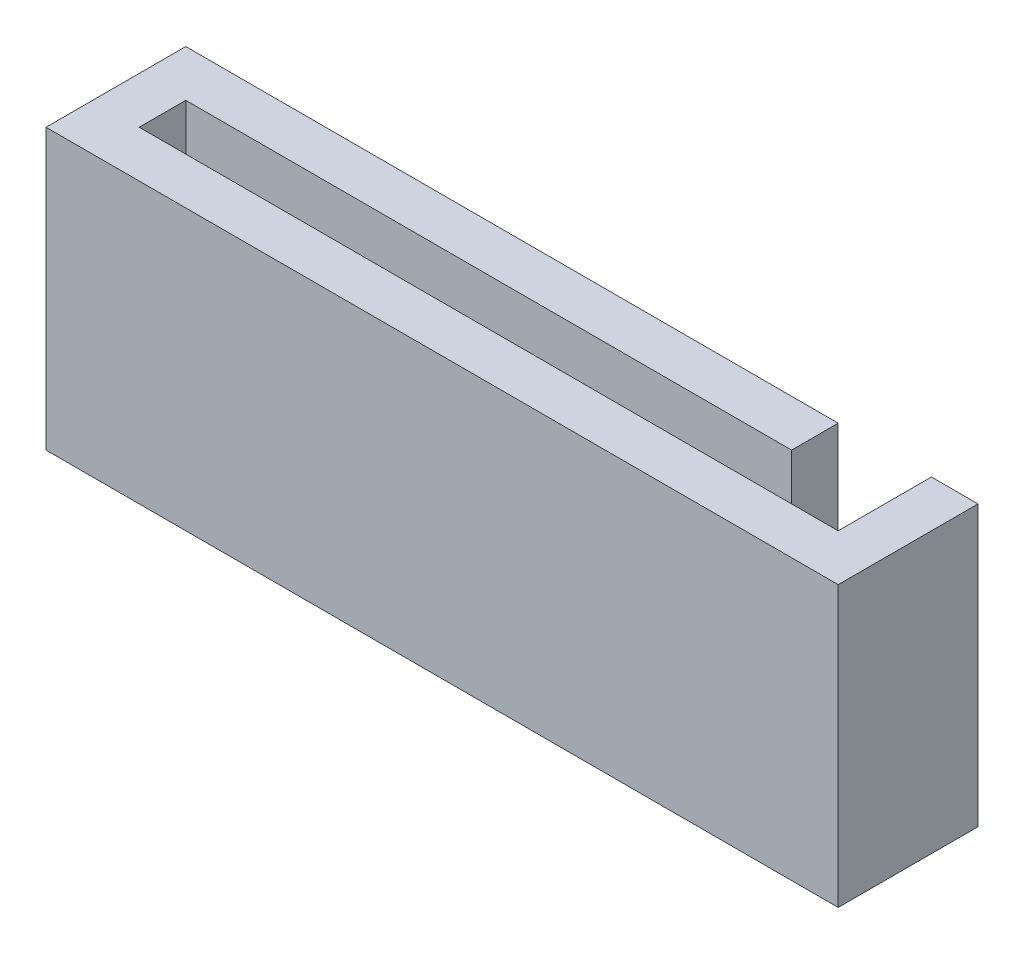
ISO-10303-21;
HEADER;
FILE_DESCRIPTION(('STEP AP214'),'2;1');
FILE_NAME('part.step','',(''),(''),'','','');
FILE_SCHEMA(('AUTOMOTIVE_DESIGN { 1 0 10303 214 1 1 1 1 }'));
ENDSEC;
DATA;
#1=APPLICATION_CONTEXT('core data for automotive mechanical design processes');
#2=APPLICATION_PROTOCOL_DEFINITION('international standard','automotive_design',2000,#1);
#3=PRODUCT_CONTEXT('',#1,'mechanical');
#4=PRODUCT('Part','Part','',(#3));
#5=PRODUCT_RELATED_PRODUCT_CATEGORY('part','',(#4));
#6=PRODUCT_DEFINITION_FORMATION('','',#4);
#7=PRODUCT_DEFINITION_CONTEXT('part definition',#1,'design');
#8=PRODUCT_DEFINITION('design','',#6,#7);
#9=PRODUCT_DEFINITION_SHAPE('','',#8);
#10=(LENGTH_UNIT() NAMED_UNIT(*) SI_UNIT(.MILLI.,.METRE.));
#11=(NAMED_UNIT(*) PLANE_ANGLE_UNIT() SI_UNIT($,.RADIAN.));
#12=(NAMED_UNIT(*) SI_UNIT($,.STERADIAN.) SOLID_ANGLE_UNIT());
#13=UNCERTAINTY_MEASURE_WITH_UNIT(LENGTH_MEASURE(1.E-05),#10,'distance_accuracy_value','');
#14=(GEOMETRIC_REPRESENTATION_CONTEXT(3) GLOBAL_UNCERTAINTY_ASSIGNED_CONTEXT((#13)) GLOBAL_UNIT_ASSIGNED_CONTEXT((#10,
#11,#12)) REPRESENTATION_CONTEXT('',''));
#15=CARTESIAN_POINT('',(0.,0.,0.));
#16=DIRECTION('',(0.,0.,1.));
#17=DIRECTION('',(1.,0.,0.));
#18=AXIS2_PLACEMENT_3D('',#15,#16,#17);
#19=CARTESIAN_POINT('',(0.,6.,-2.));
#20=DIRECTION('',(0.,0.,-1.));
#21=DIRECTION('',(-1.,0.,0.));
#22=AXIS2_PLACEMENT_3D('',#19,#20,#21);
#23=PLANE('',#22);
#24=DIRECTION('',(0.,-1.,0.));
#25=VECTOR('',#24,1.);
#26=CARTESIAN_POINT('',(-16.,6.,-2.));
#27=LINE('',#26,#25);
#28=CARTESIAN_POINT('',(-16.,6.,-2.));
#29=VERTEX_POINT('',#28);
#30=CARTESIAN_POINT('',(-16.,1.,-2.));
#31=VERTEX_POINT('',#30);
#32=EDGE_CURVE('E134',#29,#31,#27,.T.);
#33=ORIENTED_EDGE('',*,*,#32,.T.);
#34=DIRECTION('',(1.,0.,0.));
#35=VECTOR('',#34,1.);
#36=CARTESIAN_POINT('',(0.,1.,-2.));
#37=LINE('',#36,#35);
#38=CARTESIAN_POINT('',(-3.,1.,-2.));
#39=VERTEX_POINT('',#38);
#40=EDGE_CURVE('E54',#31,#39,#37,.T.);
#41=ORIENTED_EDGE('',*,*,#40,.T.);
#42=DIRECTION('',(0.,-1.,0.));
#43=VECTOR('',#42,1.);
#44=CARTESIAN_POINT('',(-3.,6.,-2.));
#45=LINE('',#44,#43);
#46=CARTESIAN_POINT('',(-3.,6.,-2.));
#47=VERTEX_POINT('',#46);
#48=EDGE_CURVE('E11',#47,#39,#45,.T.);
#49=ORIENTED_EDGE('',*,*,#48,.F.);
#50=DIRECTION('',(1.,0.,0.));
#51=VECTOR('',#50,1.);
#52=CARTESIAN_POINT('',(0.,6.,-2.));
#53=LINE('',#52,#51);
#54=EDGE_CURVE('E123',#29,#47,#53,.T.);
#55=ORIENTED_EDGE('',*,*,#54,.F.);
#56=EDGE_LOOP('',(#33,#41,#49,#55));
#57=FACE_BOUND('',#56,.T.);
#58=ADVANCED_FACE('F39',(#57),#23,.F.);
#59=CARTESIAN_POINT('',(-3.,6.,0.));
#60=DIRECTION('',(-1.,0.,0.));
#61=DIRECTION('',(0.,0.,1.));
#62=AXIS2_PLACEMENT_3D('',#59,#60,#61);
#63=PLANE('',#62);
#64=ORIENTED_EDGE('',*,*,#48,.T.);
#65=DIRECTION('',(0.,0.,-1.));
#66=VECTOR('',#65,1.);
#67=CARTESIAN_POINT('',(-3.,1.,0.));
#68=LINE('',#67,#66);
#69=CARTESIAN_POINT('',(-3.,1.,-3.));
#70=VERTEX_POINT('',#69);
#71=EDGE_CURVE('E60',#39,#70,#68,.T.);
#72=ORIENTED_EDGE('',*,*,#71,.T.);
#73=DIRECTION('',(0.,-1.,0.));
#74=VECTOR('',#73,1.);
#75=CARTESIAN_POINT('',(-3.,6.,-3.));
#76=LINE('',#75,#74);
#77=CARTESIAN_POINT('',(-3.,6.,-3.));
#78=VERTEX_POINT('',#77);
#79=EDGE_CURVE('E47',#78,#70,#76,.T.);
#80=ORIENTED_EDGE('',*,*,#79,.F.);
#81=DIRECTION('',(0.,0.,-1.));
#82=VECTOR('',#81,1.);
#83=CARTESIAN_POINT('',(-3.,6.,0.));
#84=LINE('',#83,#82);
#85=EDGE_CURVE('E115',#47,#78,#84,.T.);
#86=ORIENTED_EDGE('',*,*,#85,.F.);
#87=EDGE_LOOP('',(#64,#72,#80,#86));
#88=FACE_BOUND('',#87,.T.);
#89=ADVANCED_FACE('F117',(#88),#63,.F.);
#90=CARTESIAN_POINT('',(-17.,6.,0.));
#91=DIRECTION('',(-1.,0.,0.));
#92=DIRECTION('',(0.,0.,1.));
#93=AXIS2_PLACEMENT_3D('',#90,#91,#92);
#94=PLANE('',#93);
#95=DIRECTION('',(0.,0.,-1.));
#96=VECTOR('',#95,1.);
#97=CARTESIAN_POINT('',(-17.,0.,0.));
#98=LINE('',#97,#96);
#99=CARTESIAN_POINT('',(-17.,0.,0.));
#100=VERTEX_POINT('',#99);
#101=CARTESIAN_POINT('',(-17.,0.,-3.));
#102=VERTEX_POINT('',#101);
#103=EDGE_CURVE('E202',#100,#102,#98,.T.);
#104=ORIENTED_EDGE('',*,*,#103,.F.);
#105=DIRECTION('',(0.,-1.,0.));
#106=VECTOR('',#105,1.);
#107=CARTESIAN_POINT('',(-17.,6.,0.));
#108=LINE('',#107,#106);
#109=CARTESIAN_POINT('',(-17.,6.,0.));
#110=VERTEX_POINT('',#109);
#111=EDGE_CURVE('E264',#110,#100,#108,.T.);
#112=ORIENTED_EDGE('',*,*,#111,.F.);
#113=DIRECTION('',(0.,0.,-1.));
#114=VECTOR('',#113,1.);
#115=CARTESIAN_POINT('',(-17.,6.,0.));
#116=LINE('',#115,#114);
#117=CARTESIAN_POINT('',(-17.,6.,-3.));
#118=VERTEX_POINT('',#117);
#119=EDGE_CURVE('E206',#110,#118,#116,.T.);
#120=ORIENTED_EDGE('',*,*,#119,.T.);
#121=DIRECTION('',(0.,-1.,0.));
#122=VECTOR('',#121,1.);
#123=CARTESIAN_POINT('',(-17.,6.,-3.));
#124=LINE('',#123,#122);
#125=EDGE_CURVE('E267',#118,#102,#124,.T.);
#126=ORIENTED_EDGE('',*,*,#125,.T.);
#127=EDGE_LOOP('',(#104,#112,#120,#126));
#128=FACE_BOUND('',#127,.T.);
#129=ADVANCED_FACE('F139',(#128),#94,.T.);
#130=CARTESIAN_POINT('',(0.,6.,0.));
#131=DIRECTION('',(0.,0.,1.));
#132=DIRECTION('',(1.,0.,0.));
#133=AXIS2_PLACEMENT_3D('',#130,#131,#132);
#134=PLANE('',#133);
#135=DIRECTION('',(-1.,0.,0.));
#136=VECTOR('',#135,1.);
#137=CARTESIAN_POINT('',(0.,0.,0.));
#138=LINE('',#137,#136);
#139=CARTESIAN_POINT('',(0.,0.,0.));
#140=VERTEX_POINT('',#139);
#141=EDGE_CURVE('E234',#140,#100,#138,.T.);
#142=ORIENTED_EDGE('',*,*,#141,.F.);
#143=DIRECTION('',(0.,-1.,0.));
#144=VECTOR('',#143,1.);
#145=CARTESIAN_POINT('',(0.,6.,0.));
#146=LINE('',#145,#144);
#147=CARTESIAN_POINT('',(0.,6.,0.));
#148=VERTEX_POINT('',#147);
#149=EDGE_CURVE('E261',#148,#140,#146,.T.);
#150=ORIENTED_EDGE('',*,*,#149,.F.);
#151=DIRECTION('',(-1.,0.,0.));
#152=VECTOR('',#151,1.);
#153=CARTESIAN_POINT('',(0.,6.,0.));
#154=LINE('',#153,#152);
#155=EDGE_CURVE('E210',#148,#110,#154,.T.);
#156=ORIENTED_EDGE('',*,*,#155,.T.);
#157=ORIENTED_EDGE('',*,*,#111,.T.);
#158=EDGE_LOOP('',(#142,#150,#156,#157));
#159=FACE_BOUND('',#158,.T.);
#160=ADVANCED_FACE('F143',(#159),#134,.T.);
#161=CARTESIAN_POINT('',(0.,6.,0.));
#162=DIRECTION('',(1.,0.,0.));
#163=DIRECTION('',(0.,0.,-1.));
#164=AXIS2_PLACEMENT_3D('',#161,#162,#163);
#165=PLANE('',#164);
#166=DIRECTION('',(0.,0.,1.));
#167=VECTOR('',#166,1.);
#168=CARTESIAN_POINT('',(0.,0.,0.));
#169=LINE('',#168,#167);
#170=CARTESIAN_POINT('',(0.,0.,-3.));
#171=VERTEX_POINT('',#170);
#172=EDGE_CURVE('E238',#171,#140,#169,.T.);
#173=ORIENTED_EDGE('',*,*,#172,.F.);
#174=DIRECTION('',(0.,-1.,0.));
#175=VECTOR('',#174,1.);
#176=CARTESIAN_POINT('',(0.,6.,-3.));
#177=LINE('',#176,#175);
#178=CARTESIAN_POINT('',(0.,6.,-3.));
#179=VERTEX_POINT('',#178);
#180=EDGE_CURVE('E258',#179,#171,#177,.T.);
#181=ORIENTED_EDGE('',*,*,#180,.F.);
#182=DIRECTION('',(0.,0.,1.));
#183=VECTOR('',#182,1.);
#184=CARTESIAN_POINT('',(0.,6.,0.));
#185=LINE('',#184,#183);
#186=EDGE_CURVE('E214',#179,#148,#185,.T.);
#187=ORIENTED_EDGE('',*,*,#186,.T.);
#188=ORIENTED_EDGE('',*,*,#149,.T.);
#189=EDGE_LOOP('',(#173,#181,#187,#188));
#190=FACE_BOUND('',#189,.T.);
#191=ADVANCED_FACE('F149',(#190),#165,.T.);
#192=CARTESIAN_POINT('',(0.,6.,-3.));
#193=DIRECTION('',(0.,0.,-1.));
#194=DIRECTION('',(-1.,0.,0.));
#195=AXIS2_PLACEMENT_3D('',#192,#193,#194);
#196=PLANE('',#195);
#197=DIRECTION('',(1.,0.,0.));
#198=VECTOR('',#197,1.);
#199=CARTESIAN_POINT('',(0.,0.,-3.));
#200=LINE('',#199,#198);
#201=EDGE_CURVE('E132',#102,#171,#200,.T.);
#202=ORIENTED_EDGE('',*,*,#201,.F.);
#203=ORIENTED_EDGE('',*,*,#125,.F.);
#204=DIRECTION('',(1.,0.,0.));
#205=VECTOR('',#204,1.);
#206=CARTESIAN_POINT('',(0.,6.,-3.));
#207=LINE('',#206,#205);
#208=EDGE_CURVE('E122',#118,#78,#207,.T.);
#209=ORIENTED_EDGE('',*,*,#208,.T.);
#210=ORIENTED_EDGE('',*,*,#79,.T.);
#211=DIRECTION('',(1.,0.,0.));
#212=VECTOR('',#211,1.);
#213=CARTESIAN_POINT('',(0.,1.,-3.));
#214=LINE('',#213,#212);
#215=CARTESIAN_POINT('',(-1.,1.,-3.));
#216=VERTEX_POINT('',#215);
#217=EDGE_CURVE('E185',#70,#216,#214,.T.);
#218=ORIENTED_EDGE('',*,*,#217,.T.);
#219=DIRECTION('',(0.,-1.,0.));
#220=VECTOR('',#219,1.);
#221=CARTESIAN_POINT('',(-1.,6.,-3.));
#222=LINE('',#221,#220);
#223=CARTESIAN_POINT('',(-1.,6.,-3.));
#224=VERTEX_POINT('',#223);
#225=EDGE_CURVE('E255',#224,#216,#222,.T.);
#226=ORIENTED_EDGE('',*,*,#225,.F.);
#227=DIRECTION('',(1.,0.,0.));
#228=VECTOR('',#227,1.);
#229=CARTESIAN_POINT('',(0.,6.,-3.));
#230=LINE('',#229,#228);
#231=EDGE_CURVE('E218',#224,#179,#230,.T.);
#232=ORIENTED_EDGE('',*,*,#231,.T.);
#233=ORIENTED_EDGE('',*,*,#180,.T.);
#234=EDGE_LOOP('',(#202,#203,#209,#210,#218,#226,#232,#233));
#235=FACE_BOUND('',#234,.T.);
#236=ADVANCED_FACE('F153',(#235),#196,.T.);
#237=CARTESIAN_POINT('',(-1.,6.,0.));
#238=DIRECTION('',(1.,0.,0.));
#239=DIRECTION('',(0.,0.,-1.));
#240=AXIS2_PLACEMENT_3D('',#237,#238,#239);
#241=PLANE('',#240);
#242=ORIENTED_EDGE('',*,*,#225,.T.);
#243=DIRECTION('',(0.,0.,1.));
#244=VECTOR('',#243,1.);
#245=CARTESIAN_POINT('',(-1.,1.,0.));
#246=LINE('',#245,#244);
#247=CARTESIAN_POINT('',(-1.,1.,-0.999999999999998));
#248=VERTEX_POINT('',#247);
#249=EDGE_CURVE('E198',#216,#248,#246,.T.);
#250=ORIENTED_EDGE('',*,*,#249,.T.);
#251=DIRECTION('',(0.,-1.,0.));
#252=VECTOR('',#251,1.);
#253=CARTESIAN_POINT('',(-1.,6.,-0.999999999999998));
#254=LINE('',#253,#252);
#255=CARTESIAN_POINT('',(-1.,6.,-0.999999999999998));
#256=VERTEX_POINT('',#255);
#257=EDGE_CURVE('E251',#256,#248,#254,.T.);
#258=ORIENTED_EDGE('',*,*,#257,.F.);
#259=DIRECTION('',(0.,0.,1.));
#260=VECTOR('',#259,1.);
#261=CARTESIAN_POINT('',(-1.,6.,0.));
#262=LINE('',#261,#260);
#263=EDGE_CURVE('E222',#224,#256,#262,.T.);
#264=ORIENTED_EDGE('',*,*,#263,.F.);
#265=EDGE_LOOP('',(#242,#250,#258,#264));
#266=FACE_BOUND('',#265,.T.);
#267=ADVANCED_FACE('F157',(#266),#241,.F.);
#268=CARTESIAN_POINT('',(0.,6.,-0.999999999999998));
#269=DIRECTION('',(0.,0.,-1.));
#270=DIRECTION('',(-1.,0.,0.));
#271=AXIS2_PLACEMENT_3D('',#268,#269,#270);
#272=PLANE('',#271);
#273=DIRECTION('',(1.,0.,0.));
#274=VECTOR('',#273,1.);
#275=CARTESIAN_POINT('',(0.,1.,-0.999999999999998));
#276=LINE('',#275,#274);
#277=CARTESIAN_POINT('',(-16.,1.,-0.999999999999998));
#278=VERTEX_POINT('',#277);
#279=EDGE_CURVE('E194',#278,#248,#276,.T.);
#280=ORIENTED_EDGE('',*,*,#279,.F.);
#281=DIRECTION('',(0.,-1.,0.));
#282=VECTOR('',#281,1.);
#283=CARTESIAN_POINT('',(-16.,6.,-0.999999999999998));
#284=LINE('',#283,#282);
#285=CARTESIAN_POINT('',(-16.,6.,-0.999999999999998));
#286=VERTEX_POINT('',#285);
#287=EDGE_CURVE('E247',#286,#278,#284,.T.);
#288=ORIENTED_EDGE('',*,*,#287,.F.);
#289=DIRECTION('',(1.,0.,0.));
#290=VECTOR('',#289,1.);
#291=CARTESIAN_POINT('',(0.,6.,-0.999999999999998));
#292=LINE('',#291,#290);
#293=EDGE_CURVE('E225',#286,#256,#292,.T.);
#294=ORIENTED_EDGE('',*,*,#293,.T.);
#295=ORIENTED_EDGE('',*,*,#257,.T.);
#296=EDGE_LOOP('',(#280,#288,#294,#295));
#297=FACE_BOUND('',#296,.T.);
#298=ADVANCED_FACE('F161',(#297),#272,.T.);
#299=CARTESIAN_POINT('',(-16.,6.,0.));
#300=DIRECTION('',(1.,0.,0.));
#301=DIRECTION('',(0.,0.,-1.));
#302=AXIS2_PLACEMENT_3D('',#299,#300,#301);
#303=PLANE('',#302);
#304=DIRECTION('',(0.,0.,1.));
#305=VECTOR('',#304,1.);
#306=CARTESIAN_POINT('',(-16.,1.,0.));
#307=LINE('',#306,#305);
#308=EDGE_CURVE('E189',#31,#278,#307,.T.);
#309=ORIENTED_EDGE('',*,*,#308,.F.);
#310=ORIENTED_EDGE('',*,*,#32,.F.);
#311=DIRECTION('',(0.,0.,1.));
#312=VECTOR('',#311,1.);
#313=CARTESIAN_POINT('',(-16.,6.,0.));
#314=LINE('',#313,#312);
#315=EDGE_CURVE('E130',#29,#286,#314,.T.);
#316=ORIENTED_EDGE('',*,*,#315,.T.);
#317=ORIENTED_EDGE('',*,*,#287,.T.);
#318=EDGE_LOOP('',(#309,#310,#316,#317));
#319=FACE_BOUND('',#318,.T.);
#320=ADVANCED_FACE('F165',(#319),#303,.T.);
#321=CARTESIAN_POINT('',(0.,6.,0.));
#322=DIRECTION('',(0.,1.,0.));
#323=DIRECTION('',(0.,0.,1.));
#324=AXIS2_PLACEMENT_3D('',#321,#322,#323);
#325=PLANE('',#324);
#326=ORIENTED_EDGE('',*,*,#54,.T.);
#327=ORIENTED_EDGE('',*,*,#85,.T.);
#328=ORIENTED_EDGE('',*,*,#208,.F.);
#329=ORIENTED_EDGE('',*,*,#119,.F.);
#330=ORIENTED_EDGE('',*,*,#155,.F.);
#331=ORIENTED_EDGE('',*,*,#186,.F.);
#332=ORIENTED_EDGE('',*,*,#231,.F.);
#333=ORIENTED_EDGE('',*,*,#263,.T.);
#334=ORIENTED_EDGE('',*,*,#293,.F.);
#335=ORIENTED_EDGE('',*,*,#315,.F.);
#336=EDGE_LOOP('',(#326,#327,#328,#329,#330,#331,#332,#333,#334,#335));
#337=FACE_BOUND('',#336,.T.);
#338=ADVANCED_FACE('F127',(#337),#325,.T.);
#339=CARTESIAN_POINT('',(0.,0.,0.));
#340=DIRECTION('',(0.,1.,0.));
#341=DIRECTION('',(0.,0.,1.));
#342=AXIS2_PLACEMENT_3D('',#339,#340,#341);
#343=PLANE('',#342);
#344=ORIENTED_EDGE('',*,*,#103,.T.);
#345=ORIENTED_EDGE('',*,*,#201,.T.);
#346=ORIENTED_EDGE('',*,*,#172,.T.);
#347=ORIENTED_EDGE('',*,*,#141,.T.);
#348=EDGE_LOOP('',(#344,#345,#346,#347));
#349=FACE_BOUND('',#348,.T.);
#350=ADVANCED_FACE('F170',(#349),#343,.F.);
#351=CARTESIAN_POINT('',(0.,1.,0.));
#352=DIRECTION('',(0.,1.,0.));
#353=DIRECTION('',(0.,0.,1.));
#354=AXIS2_PLACEMENT_3D('',#351,#352,#353);
#355=PLANE('',#354);
#356=ORIENTED_EDGE('',*,*,#71,.F.);
#357=ORIENTED_EDGE('',*,*,#40,.F.);
#358=ORIENTED_EDGE('',*,*,#308,.T.);
#359=ORIENTED_EDGE('',*,*,#279,.T.);
#360=ORIENTED_EDGE('',*,*,#249,.F.);
#361=ORIENTED_EDGE('',*,*,#217,.F.);
#362=EDGE_LOOP('',(#356,#357,#358,#359,#360,#361));
#363=FACE_BOUND('',#362,.T.);
#364=ADVANCED_FACE('F173',(#363),#355,.T.);
#365=CLOSED_SHELL('',(#58,#89,#129,#160,#191,#236,#267,#298,#320,#338,#350,#364));
#366=MANIFOLD_SOLID_BREP('B2',#365);
#367=ADVANCED_BREP_SHAPE_REPRESENTATION('',(#18,#366),#14);
#368=SHAPE_DEFINITION_REPRESENTATION(#9,#367);
ENDSEC;
END-ISO-10303-21;
